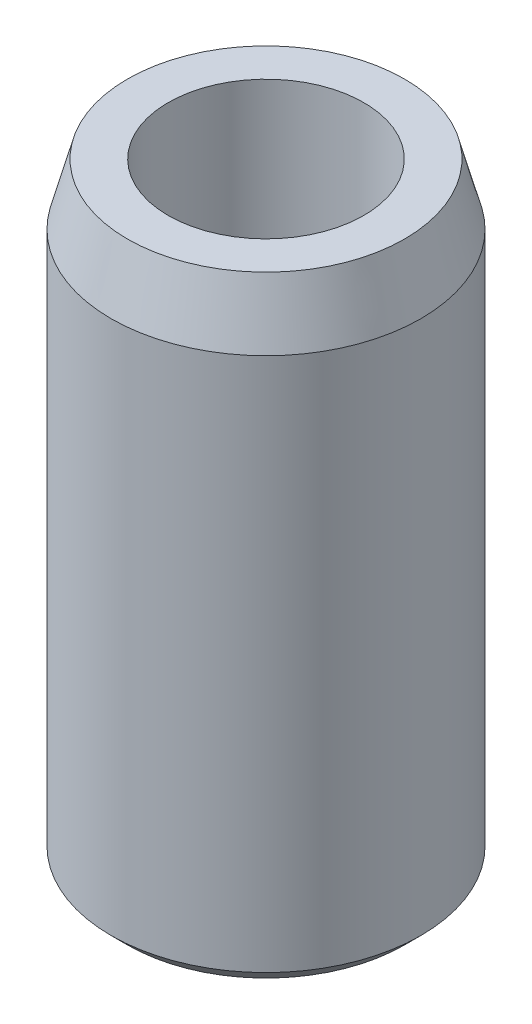
ISO-10303-21;
HEADER;
FILE_DESCRIPTION(('STEP AP214'),'2;1');
FILE_NAME('part.step','',(''),(''),'','','');
FILE_SCHEMA(('AUTOMOTIVE_DESIGN { 1 0 10303 214 1 1 1 1 }'));
ENDSEC;
DATA;
#1=APPLICATION_CONTEXT('core data for automotive mechanical design processes');
#2=APPLICATION_PROTOCOL_DEFINITION('international standard','automotive_design',2000,#1);
#3=PRODUCT_CONTEXT('',#1,'mechanical');
#4=PRODUCT('Part','Part','',(#3));
#5=PRODUCT_RELATED_PRODUCT_CATEGORY('part','',(#4));
#6=PRODUCT_DEFINITION_FORMATION('','',#4);
#7=PRODUCT_DEFINITION_CONTEXT('part definition',#1,'design');
#8=PRODUCT_DEFINITION('design','',#6,#7);
#9=PRODUCT_DEFINITION_SHAPE('','',#8);
#10=(LENGTH_UNIT() NAMED_UNIT(*) SI_UNIT(.MILLI.,.METRE.));
#11=(NAMED_UNIT(*) PLANE_ANGLE_UNIT() SI_UNIT($,.RADIAN.));
#12=(NAMED_UNIT(*) SI_UNIT($,.STERADIAN.) SOLID_ANGLE_UNIT());
#13=UNCERTAINTY_MEASURE_WITH_UNIT(LENGTH_MEASURE(1.E-05),#10,'distance_accuracy_value','');
#14=(GEOMETRIC_REPRESENTATION_CONTEXT(3) GLOBAL_UNCERTAINTY_ASSIGNED_CONTEXT((#13)) GLOBAL_UNIT_ASSIGNED_CONTEXT((#10,
#11,#12)) REPRESENTATION_CONTEXT('',''));
#15=CARTESIAN_POINT('',(0.,0.,0.));
#16=DIRECTION('',(0.,0.,1.));
#17=DIRECTION('',(1.,0.,0.));
#18=AXIS2_PLACEMENT_3D('',#15,#16,#17);
#19=CARTESIAN_POINT('',(0.,-75.,0.));
#20=DIRECTION('',(0.,1.,0.));
#21=DIRECTION('',(0.,0.,1.));
#22=AXIS2_PLACEMENT_3D('',#19,#20,#21);
#23=CYLINDRICAL_SURFACE('',#22,19.);
#24=CARTESIAN_POINT('',(0.,-73.,0.));
#25=DIRECTION('',(0.,1.,0.));
#26=DIRECTION('',(0.,0.,1.));
#27=AXIS2_PLACEMENT_3D('',#24,#25,#26);
#28=CIRCLE('',#27,19.);
#29=CARTESIAN_POINT('',(0.,-73.,19.));
#30=VERTEX_POINT('',#29);
#31=EDGE_CURVE('E52',#30,#30,#28,.T.);
#32=ORIENTED_EDGE('',*,*,#31,.T.);
#33=EDGE_LOOP('',(#32));
#34=FACE_BOUND('',#33,.T.);
#35=CARTESIAN_POINT('',(0.,-7.46410161513757,0.));
#36=DIRECTION('',(0.,1.,0.));
#37=DIRECTION('',(0.,0.,1.));
#38=AXIS2_PLACEMENT_3D('',#35,#36,#37);
#39=CIRCLE('',#38,19.);
#40=CARTESIAN_POINT('',(0.,-7.46410161513757,19.));
#41=VERTEX_POINT('',#40);
#42=EDGE_CURVE('E58',#41,#41,#39,.F.);
#43=ORIENTED_EDGE('',*,*,#42,.T.);
#44=EDGE_LOOP('',(#43));
#45=FACE_BOUND('',#44,.T.);
#46=ADVANCED_FACE('F43',(#34,#45),#23,.T.);
#47=CARTESIAN_POINT('',(0.,-75.,0.));
#48=DIRECTION('',(0.,1.,0.));
#49=DIRECTION('',(0.,0.,1.));
#50=AXIS2_PLACEMENT_3D('',#47,#48,#49);
#51=PLANE('',#50);
#52=CARTESIAN_POINT('',(0.,-75.,0.));
#53=DIRECTION('',(0.,1.,0.));
#54=DIRECTION('',(0.,0.,1.));
#55=AXIS2_PLACEMENT_3D('',#52,#53,#54);
#56=CIRCLE('',#55,17.);
#57=CARTESIAN_POINT('',(0.,-75.,17.));
#58=VERTEX_POINT('',#57);
#59=EDGE_CURVE('E10',#58,#58,#56,.F.);
#60=ORIENTED_EDGE('',*,*,#59,.T.);
#61=EDGE_LOOP('',(#60));
#62=FACE_BOUND('',#61,.T.);
#63=CARTESIAN_POINT('',(0.,-75.,0.));
#64=DIRECTION('',(0.,1.,0.));
#65=DIRECTION('',(0.,0.,1.));
#66=AXIS2_PLACEMENT_3D('',#63,#64,#65);
#67=CIRCLE('',#66,12.);
#68=CARTESIAN_POINT('',(0.,-75.,12.));
#69=VERTEX_POINT('',#68);
#70=EDGE_CURVE('E70',#69,#69,#67,.T.);
#71=ORIENTED_EDGE('',*,*,#70,.T.);
#72=EDGE_LOOP('',(#71));
#73=FACE_BOUND('',#72,.T.);
#74=ADVANCED_FACE('F80',(#62,#73),#51,.F.);
#75=CARTESIAN_POINT('',(0.,0.,0.));
#76=DIRECTION('',(0.,1.,0.));
#77=DIRECTION('',(0.,0.,1.));
#78=AXIS2_PLACEMENT_3D('',#75,#76,#77);
#79=PLANE('',#78);
#80=CARTESIAN_POINT('',(0.,0.,0.));
#81=DIRECTION('',(0.,1.,0.));
#82=DIRECTION('',(0.,0.,1.));
#83=AXIS2_PLACEMENT_3D('',#80,#81,#82);
#84=CIRCLE('',#83,17.);
#85=CARTESIAN_POINT('',(0.,0.,17.0000000000001));
#86=VERTEX_POINT('',#85);
#87=EDGE_CURVE('E64',#86,#86,#84,.T.);
#88=ORIENTED_EDGE('',*,*,#87,.T.);
#89=EDGE_LOOP('',(#88));
#90=FACE_BOUND('',#89,.T.);
#91=CARTESIAN_POINT('',(0.,0.,0.));
#92=DIRECTION('',(0.,1.,0.));
#93=DIRECTION('',(0.,0.,1.));
#94=AXIS2_PLACEMENT_3D('',#91,#92,#93);
#95=CIRCLE('',#94,12.);
#96=CARTESIAN_POINT('',(0.,0.,12.));
#97=VERTEX_POINT('',#96);
#98=EDGE_CURVE('E71',#97,#97,#95,.T.);
#99=ORIENTED_EDGE('',*,*,#98,.F.);
#100=EDGE_LOOP('',(#99));
#101=FACE_BOUND('',#100,.T.);
#102=ADVANCED_FACE('F86',(#90,#101),#79,.T.);
#103=CARTESIAN_POINT('',(0.,-75.,0.));
#104=DIRECTION('',(0.,1.,0.));
#105=DIRECTION('',(0.,0.,1.));
#106=AXIS2_PLACEMENT_3D('',#103,#104,#105);
#107=CYLINDRICAL_SURFACE('',#106,12.);
#108=ORIENTED_EDGE('',*,*,#70,.F.);
#109=EDGE_LOOP('',(#108));
#110=FACE_BOUND('',#109,.T.);
#111=ORIENTED_EDGE('',*,*,#98,.T.);
#112=EDGE_LOOP('',(#111));
#113=FACE_BOUND('',#112,.T.);
#114=ADVANCED_FACE('F82',(#110,#113),#107,.F.);
#115=CARTESIAN_POINT('',(0.,0.,0.));
#116=DIRECTION('',(0.,-1.,0.));
#117=DIRECTION('',(0.,0.,-1.));
#118=AXIS2_PLACEMENT_3D('',#115,#116,#117);
#119=CONICAL_SURFACE('',#118,17.,0.26179938779915);
#120=ORIENTED_EDGE('',*,*,#42,.F.);
#121=EDGE_LOOP('',(#120));
#122=FACE_BOUND('',#121,.T.);
#123=ORIENTED_EDGE('',*,*,#87,.F.);
#124=EDGE_LOOP('',(#123));
#125=FACE_BOUND('',#124,.T.);
#126=ADVANCED_FACE('F85',(#122,#125),#119,.T.);
#127=CARTESIAN_POINT('',(0.,-73.,0.));
#128=DIRECTION('',(0.,1.,0.));
#129=DIRECTION('',(0.,0.,1.));
#130=AXIS2_PLACEMENT_3D('',#127,#128,#129);
#131=CONICAL_SURFACE('',#130,19.,0.785398163397447);
#132=ORIENTED_EDGE('',*,*,#59,.F.);
#133=EDGE_LOOP('',(#132));
#134=FACE_BOUND('',#133,.T.);
#135=ORIENTED_EDGE('',*,*,#31,.F.);
#136=EDGE_LOOP('',(#135));
#137=FACE_BOUND('',#136,.T.);
#138=ADVANCED_FACE('F46',(#134,#137),#131,.T.);
#139=CLOSED_SHELL('',(#46,#74,#102,#114,#126,#138));
#140=MANIFOLD_SOLID_BREP('B2',#139);
#141=ADVANCED_BREP_SHAPE_REPRESENTATION('',(#18,#140),#14);
#142=SHAPE_DEFINITION_REPRESENTATION(#9,#141);
ENDSEC;
END-ISO-10303-21;
